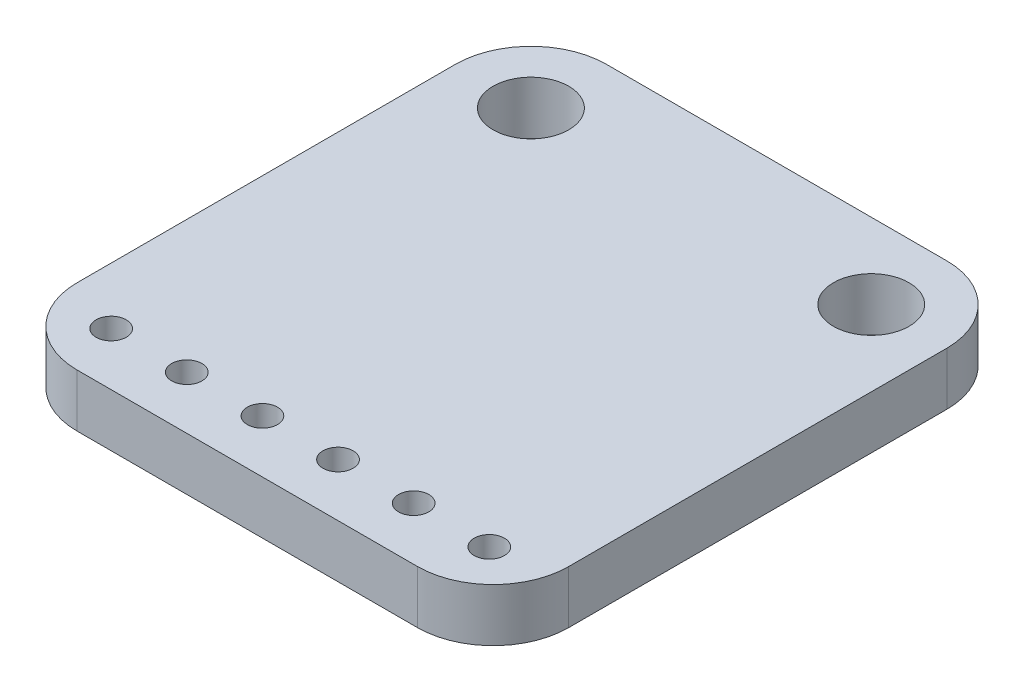
ISO-10303-21;
HEADER;
FILE_DESCRIPTION(('STEP AP214'),'2;1');
FILE_NAME('part.step','',(''),(''),'','','');
FILE_SCHEMA(('AUTOMOTIVE_DESIGN { 1 0 10303 214 1 1 1 1 }'));
ENDSEC;
DATA;
#1=APPLICATION_CONTEXT('core data for automotive mechanical design processes');
#2=APPLICATION_PROTOCOL_DEFINITION('international standard','automotive_design',2000,#1);
#3=PRODUCT_CONTEXT('',#1,'mechanical');
#4=PRODUCT('Part','Part','',(#3));
#5=PRODUCT_RELATED_PRODUCT_CATEGORY('part','',(#4));
#6=PRODUCT_DEFINITION_FORMATION('','',#4);
#7=PRODUCT_DEFINITION_CONTEXT('part definition',#1,'design');
#8=PRODUCT_DEFINITION('design','',#6,#7);
#9=PRODUCT_DEFINITION_SHAPE('','',#8);
#10=(LENGTH_UNIT() NAMED_UNIT(*) SI_UNIT(.MILLI.,.METRE.));
#11=(NAMED_UNIT(*) PLANE_ANGLE_UNIT() SI_UNIT($,.RADIAN.));
#12=(NAMED_UNIT(*) SI_UNIT($,.STERADIAN.) SOLID_ANGLE_UNIT());
#13=UNCERTAINTY_MEASURE_WITH_UNIT(LENGTH_MEASURE(1.E-05),#10,'distance_accuracy_value','');
#14=(GEOMETRIC_REPRESENTATION_CONTEXT(3) GLOBAL_UNCERTAINTY_ASSIGNED_CONTEXT((#13)) GLOBAL_UNIT_ASSIGNED_CONTEXT((#10,
#11,#12)) REPRESENTATION_CONTEXT('',''));
#15=CARTESIAN_POINT('',(0.,0.,0.));
#16=DIRECTION('',(0.,0.,1.));
#17=DIRECTION('',(1.,0.,0.));
#18=AXIS2_PLACEMENT_3D('',#15,#16,#17);
#19=CARTESIAN_POINT('',(0.,0.,0.));
#20=DIRECTION('',(0.,1.,0.));
#21=DIRECTION('',(0.,0.,1.));
#22=AXIS2_PLACEMENT_3D('',#19,#20,#21);
#23=PLANE('',#22);
#24=CARTESIAN_POINT('',(-5.715,0.,-6.34999999999999));
#25=DIRECTION('',(0.,-1.,0.));
#26=DIRECTION('',(0.,0.,-1.));
#27=AXIS2_PLACEMENT_3D('',#24,#25,#26);
#28=CIRCLE('',#27,1.27);
#29=CARTESIAN_POINT('',(-5.715,0.,-7.61999999999999));
#30=VERTEX_POINT('',#29);
#31=EDGE_CURVE('E518',#30,#30,#28,.T.);
#32=ORIENTED_EDGE('',*,*,#31,.F.);
#33=EDGE_LOOP('',(#32));
#34=FACE_BOUND('',#33,.T.);
#35=CARTESIAN_POINT('',(5.715,0.,-6.34999999999999));
#36=DIRECTION('',(0.,-1.,0.));
#37=DIRECTION('',(0.,0.,-1.));
#38=AXIS2_PLACEMENT_3D('',#35,#36,#37);
#39=CIRCLE('',#38,1.27);
#40=CARTESIAN_POINT('',(5.715,0.,-7.61999999999999));
#41=VERTEX_POINT('',#40);
#42=EDGE_CURVE('E495',#41,#41,#39,.T.);
#43=ORIENTED_EDGE('',*,*,#42,.F.);
#44=EDGE_LOOP('',(#43));
#45=FACE_BOUND('',#44,.T.);
#46=DIRECTION('',(0.,0.,1.));
#47=VECTOR('',#46,1.);
#48=CARTESIAN_POINT('',(-8.255,0.,-8.89));
#49=LINE('',#48,#47);
#50=CARTESIAN_POINT('',(-8.255,0.,-6.34999999999999));
#51=VERTEX_POINT('',#50);
#52=CARTESIAN_POINT('',(-8.255,0.,6.35));
#53=VERTEX_POINT('',#52);
#54=EDGE_CURVE('E258',#51,#53,#49,.T.);
#55=ORIENTED_EDGE('',*,*,#54,.F.);
#56=CARTESIAN_POINT('',(-5.715,0.,-6.34999999999999));
#57=DIRECTION('',(0.,1.,0.));
#58=DIRECTION('',(0.,0.,1.));
#59=AXIS2_PLACEMENT_3D('',#56,#57,#58);
#60=CIRCLE('',#59,2.54);
#61=CARTESIAN_POINT('',(-5.715,0.,-8.89));
#62=VERTEX_POINT('',#61);
#63=EDGE_CURVE('E280',#51,#62,#60,.F.);
#64=ORIENTED_EDGE('',*,*,#63,.T.);
#65=DIRECTION('',(-1.,0.,0.));
#66=VECTOR('',#65,1.);
#67=CARTESIAN_POINT('',(-8.255,0.,-8.89));
#68=LINE('',#67,#66);
#69=CARTESIAN_POINT('',(5.715,0.,-8.89));
#70=VERTEX_POINT('',#69);
#71=EDGE_CURVE('E254',#70,#62,#68,.T.);
#72=ORIENTED_EDGE('',*,*,#71,.F.);
#73=CARTESIAN_POINT('',(5.715,0.,-6.34999999999999));
#74=DIRECTION('',(0.,1.,0.));
#75=DIRECTION('',(0.,0.,1.));
#76=AXIS2_PLACEMENT_3D('',#73,#74,#75);
#77=CIRCLE('',#76,2.54);
#78=CARTESIAN_POINT('',(8.255,0.,-6.34999999999999));
#79=VERTEX_POINT('',#78);
#80=EDGE_CURVE('E277',#70,#79,#77,.F.);
#81=ORIENTED_EDGE('',*,*,#80,.T.);
#82=DIRECTION('',(0.,0.,-1.));
#83=VECTOR('',#82,1.);
#84=CARTESIAN_POINT('',(8.255,0.,-8.89));
#85=LINE('',#84,#83);
#86=CARTESIAN_POINT('',(8.255,0.,6.35));
#87=VERTEX_POINT('',#86);
#88=EDGE_CURVE('E232',#87,#79,#85,.T.);
#89=ORIENTED_EDGE('',*,*,#88,.F.);
#90=CARTESIAN_POINT('',(5.715,0.,6.35));
#91=DIRECTION('',(0.,1.,0.));
#92=DIRECTION('',(0.,0.,1.));
#93=AXIS2_PLACEMENT_3D('',#90,#91,#92);
#94=CIRCLE('',#93,2.54);
#95=CARTESIAN_POINT('',(5.715,0.,8.89));
#96=VERTEX_POINT('',#95);
#97=EDGE_CURVE('E274',#87,#96,#94,.F.);
#98=ORIENTED_EDGE('',*,*,#97,.T.);
#99=DIRECTION('',(1.,0.,0.));
#100=VECTOR('',#99,1.);
#101=CARTESIAN_POINT('',(-8.255,0.,8.89));
#102=LINE('',#101,#100);
#103=CARTESIAN_POINT('',(-5.715,0.,8.89));
#104=VERTEX_POINT('',#103);
#105=EDGE_CURVE('E238',#104,#96,#102,.T.);
#106=ORIENTED_EDGE('',*,*,#105,.F.);
#107=CARTESIAN_POINT('',(-5.715,0.,6.35));
#108=DIRECTION('',(0.,1.,0.));
#109=DIRECTION('',(0.,0.,1.));
#110=AXIS2_PLACEMENT_3D('',#107,#108,#109);
#111=CIRCLE('',#110,2.54);
#112=EDGE_CURVE('E271',#104,#53,#111,.F.);
#113=ORIENTED_EDGE('',*,*,#112,.T.);
#114=EDGE_LOOP('',(#55,#64,#72,#81,#89,#98,#106,#113));
#115=FACE_BOUND('',#114,.T.);
#116=CARTESIAN_POINT('',(-6.35,0.,7.112));
#117=DIRECTION('',(0.,1.,0.));
#118=DIRECTION('',(0.,0.,1.));
#119=AXIS2_PLACEMENT_3D('',#116,#117,#118);
#120=CIRCLE('',#119,0.508);
#121=CARTESIAN_POINT('',(-6.35,0.,7.62));
#122=VERTEX_POINT('',#121);
#123=EDGE_CURVE('E228',#122,#122,#120,.F.);
#124=ORIENTED_EDGE('',*,*,#123,.F.);
#125=EDGE_LOOP('',(#124));
#126=FACE_BOUND('',#125,.T.);
#127=CARTESIAN_POINT('',(-3.81,0.,7.112));
#128=DIRECTION('',(0.,1.,0.));
#129=DIRECTION('',(0.,0.,1.));
#130=AXIS2_PLACEMENT_3D('',#127,#128,#129);
#131=CIRCLE('',#130,0.508);
#132=CARTESIAN_POINT('',(-3.81,0.,7.62));
#133=VERTEX_POINT('',#132);
#134=EDGE_CURVE('E220',#133,#133,#131,.F.);
#135=ORIENTED_EDGE('',*,*,#134,.F.);
#136=EDGE_LOOP('',(#135));
#137=FACE_BOUND('',#136,.T.);
#138=CARTESIAN_POINT('',(-1.27,0.,7.112));
#139=DIRECTION('',(0.,1.,0.));
#140=DIRECTION('',(0.,0.,1.));
#141=AXIS2_PLACEMENT_3D('',#138,#139,#140);
#142=CIRCLE('',#141,0.508);
#143=CARTESIAN_POINT('',(-1.27,0.,7.62));
#144=VERTEX_POINT('',#143);
#145=EDGE_CURVE('E212',#144,#144,#142,.F.);
#146=ORIENTED_EDGE('',*,*,#145,.F.);
#147=EDGE_LOOP('',(#146));
#148=FACE_BOUND('',#147,.T.);
#149=CARTESIAN_POINT('',(1.27,0.,7.112));
#150=DIRECTION('',(0.,1.,0.));
#151=DIRECTION('',(0.,0.,1.));
#152=AXIS2_PLACEMENT_3D('',#149,#150,#151);
#153=CIRCLE('',#152,0.508);
#154=CARTESIAN_POINT('',(1.27,0.,7.62));
#155=VERTEX_POINT('',#154);
#156=EDGE_CURVE('E204',#155,#155,#153,.F.);
#157=ORIENTED_EDGE('',*,*,#156,.F.);
#158=EDGE_LOOP('',(#157));
#159=FACE_BOUND('',#158,.T.);
#160=CARTESIAN_POINT('',(3.81,0.,7.112));
#161=DIRECTION('',(0.,1.,0.));
#162=DIRECTION('',(0.,0.,1.));
#163=AXIS2_PLACEMENT_3D('',#160,#161,#162);
#164=CIRCLE('',#163,0.508000000000001);
#165=CARTESIAN_POINT('',(3.81,0.,7.62));
#166=VERTEX_POINT('',#165);
#167=EDGE_CURVE('E196',#166,#166,#164,.F.);
#168=ORIENTED_EDGE('',*,*,#167,.F.);
#169=EDGE_LOOP('',(#168));
#170=FACE_BOUND('',#169,.T.);
#171=CARTESIAN_POINT('',(6.35,0.,7.112));
#172=DIRECTION('',(0.,1.,0.));
#173=DIRECTION('',(0.,0.,1.));
#174=AXIS2_PLACEMENT_3D('',#171,#172,#173);
#175=CIRCLE('',#174,0.508000000000001);
#176=CARTESIAN_POINT('',(6.35,0.,7.62));
#177=VERTEX_POINT('',#176);
#178=EDGE_CURVE('E182',#177,#177,#175,.F.);
#179=ORIENTED_EDGE('',*,*,#178,.F.);
#180=EDGE_LOOP('',(#179));
#181=FACE_BOUND('',#180,.T.);
#182=DIRECTION('',(0.,0.,1.));
#183=VECTOR('',#182,1.);
#184=CARTESIAN_POINT('',(1.975,0.,-3.24499999999999));
#185=LINE('',#184,#183);
#186=CARTESIAN_POINT('',(1.975,0.,-3.24499999999999));
#187=VERTEX_POINT('',#186);
#188=CARTESIAN_POINT('',(1.975,0.,0.705000000000006));
#189=VERTEX_POINT('',#188);
#190=EDGE_CURVE('E176',#187,#189,#185,.T.);
#191=ORIENTED_EDGE('',*,*,#190,.F.);
#192=DIRECTION('',(1.,0.,0.));
#193=VECTOR('',#192,1.);
#194=CARTESIAN_POINT('',(1.975,0.,-3.24499999999999));
#195=LINE('',#194,#193);
#196=CARTESIAN_POINT('',(-1.975,0.,-3.24499999999999));
#197=VERTEX_POINT('',#196);
#198=EDGE_CURVE('E173',#197,#187,#195,.T.);
#199=ORIENTED_EDGE('',*,*,#198,.F.);
#200=DIRECTION('',(0.,0.,-1.));
#201=VECTOR('',#200,1.);
#202=CARTESIAN_POINT('',(-1.975,0.,-3.24499999999999));
#203=LINE('',#202,#201);
#204=CARTESIAN_POINT('',(-1.975,0.,0.705000000000005));
#205=VERTEX_POINT('',#204);
#206=EDGE_CURVE('E68',#205,#197,#203,.T.);
#207=ORIENTED_EDGE('',*,*,#206,.F.);
#208=DIRECTION('',(-1.,0.,0.));
#209=VECTOR('',#208,1.);
#210=CARTESIAN_POINT('',(1.975,0.,0.705000000000006));
#211=LINE('',#210,#209);
#212=EDGE_CURVE('E60',#189,#205,#211,.T.);
#213=ORIENTED_EDGE('',*,*,#212,.F.);
#214=EDGE_LOOP('',(#191,#199,#207,#213));
#215=FACE_BOUND('',#214,.T.);
#216=ADVANCED_FACE('F41',(#34,#45,#115,#126,#137,#148,#159,#170,#181,#215),#23,.F.);
#217=CARTESIAN_POINT('',(8.255,1.778,-8.89));
#218=DIRECTION('',(-1.,0.,0.));
#219=DIRECTION('',(0.,0.,1.));
#220=AXIS2_PLACEMENT_3D('',#217,#218,#219);
#221=PLANE('',#220);
#222=ORIENTED_EDGE('',*,*,#88,.T.);
#223=DIRECTION('',(0.,-1.,0.));
#224=VECTOR('',#223,1.);
#225=CARTESIAN_POINT('',(8.255,1.778,-6.34999999999999));
#226=LINE('',#225,#224);
#227=CARTESIAN_POINT('',(8.255,1.778,-6.34999999999999));
#228=VERTEX_POINT('',#227);
#229=EDGE_CURVE('E306',#79,#228,#226,.F.);
#230=ORIENTED_EDGE('',*,*,#229,.T.);
#231=DIRECTION('',(0.,0.,-1.));
#232=VECTOR('',#231,1.);
#233=CARTESIAN_POINT('',(8.255,1.778,-8.89));
#234=LINE('',#233,#232);
#235=CARTESIAN_POINT('',(8.255,1.778,6.35));
#236=VERTEX_POINT('',#235);
#237=EDGE_CURVE('E233',#236,#228,#234,.T.);
#238=ORIENTED_EDGE('',*,*,#237,.F.);
#239=DIRECTION('',(0.,-1.,0.));
#240=VECTOR('',#239,1.);
#241=CARTESIAN_POINT('',(8.255,1.778,6.35));
#242=LINE('',#241,#240);
#243=EDGE_CURVE('E302',#236,#87,#242,.T.);
#244=ORIENTED_EDGE('',*,*,#243,.T.);
#245=EDGE_LOOP('',(#222,#230,#238,#244));
#246=FACE_BOUND('',#245,.T.);
#247=ADVANCED_FACE('F328',(#246),#221,.F.);
#248=CARTESIAN_POINT('',(-8.255,1.778,-8.89));
#249=DIRECTION('',(0.,0.,1.));
#250=DIRECTION('',(1.,0.,0.));
#251=AXIS2_PLACEMENT_3D('',#248,#249,#250);
#252=PLANE('',#251);
#253=ORIENTED_EDGE('',*,*,#71,.T.);
#254=DIRECTION('',(0.,-1.,0.));
#255=VECTOR('',#254,1.);
#256=CARTESIAN_POINT('',(-5.715,1.778,-8.89));
#257=LINE('',#256,#255);
#258=CARTESIAN_POINT('',(-5.715,1.778,-8.89));
#259=VERTEX_POINT('',#258);
#260=EDGE_CURVE('E287',#62,#259,#257,.F.);
#261=ORIENTED_EDGE('',*,*,#260,.T.);
#262=DIRECTION('',(-1.,0.,0.));
#263=VECTOR('',#262,1.);
#264=CARTESIAN_POINT('',(-8.255,1.778,-8.89));
#265=LINE('',#264,#263);
#266=CARTESIAN_POINT('',(5.715,1.778,-8.89));
#267=VERTEX_POINT('',#266);
#268=EDGE_CURVE('E237',#267,#259,#265,.T.);
#269=ORIENTED_EDGE('',*,*,#268,.F.);
#270=DIRECTION('',(0.,-1.,0.));
#271=VECTOR('',#270,1.);
#272=CARTESIAN_POINT('',(5.715,1.778,-8.89));
#273=LINE('',#272,#271);
#274=EDGE_CURVE('E283',#267,#70,#273,.T.);
#275=ORIENTED_EDGE('',*,*,#274,.T.);
#276=EDGE_LOOP('',(#253,#261,#269,#275));
#277=FACE_BOUND('',#276,.T.);
#278=ADVANCED_FACE('F339',(#277),#252,.F.);
#279=CARTESIAN_POINT('',(-8.255,1.778,-8.89));
#280=DIRECTION('',(1.,0.,0.));
#281=DIRECTION('',(0.,0.,-1.));
#282=AXIS2_PLACEMENT_3D('',#279,#280,#281);
#283=PLANE('',#282);
#284=DIRECTION('',(0.,0.,1.));
#285=VECTOR('',#284,1.);
#286=CARTESIAN_POINT('',(-8.255,1.778,-8.89));
#287=LINE('',#286,#285);
#288=CARTESIAN_POINT('',(-8.255,1.778,-6.34999999999999));
#289=VERTEX_POINT('',#288);
#290=CARTESIAN_POINT('',(-8.255,1.778,6.35));
#291=VERTEX_POINT('',#290);
#292=EDGE_CURVE('E242',#289,#291,#287,.T.);
#293=ORIENTED_EDGE('',*,*,#292,.F.);
#294=DIRECTION('',(0.,-1.,0.));
#295=VECTOR('',#294,1.);
#296=CARTESIAN_POINT('',(-8.255,1.778,-6.34999999999999));
#297=LINE('',#296,#295);
#298=EDGE_CURVE('E267',#289,#51,#297,.T.);
#299=ORIENTED_EDGE('',*,*,#298,.T.);
#300=ORIENTED_EDGE('',*,*,#54,.T.);
#301=DIRECTION('',(0.,-1.,0.));
#302=VECTOR('',#301,1.);
#303=CARTESIAN_POINT('',(-8.255,1.778,6.35));
#304=LINE('',#303,#302);
#305=EDGE_CURVE('E250',#53,#291,#304,.F.);
#306=ORIENTED_EDGE('',*,*,#305,.T.);
#307=EDGE_LOOP('',(#293,#299,#300,#306));
#308=FACE_BOUND('',#307,.T.);
#309=ADVANCED_FACE('F347',(#308),#283,.F.);
#310=CARTESIAN_POINT('',(-8.255,1.778,8.89));
#311=DIRECTION('',(0.,0.,-1.));
#312=DIRECTION('',(-1.,0.,0.));
#313=AXIS2_PLACEMENT_3D('',#310,#311,#312);
#314=PLANE('',#313);
#315=ORIENTED_EDGE('',*,*,#105,.T.);
#316=DIRECTION('',(0.,-1.,0.));
#317=VECTOR('',#316,1.);
#318=CARTESIAN_POINT('',(5.715,1.778,8.89));
#319=LINE('',#318,#317);
#320=CARTESIAN_POINT('',(5.715,1.778,8.89));
#321=VERTEX_POINT('',#320);
#322=EDGE_CURVE('E11',#96,#321,#319,.F.);
#323=ORIENTED_EDGE('',*,*,#322,.T.);
#324=DIRECTION('',(1.,0.,0.));
#325=VECTOR('',#324,1.);
#326=CARTESIAN_POINT('',(-8.255,1.778,8.89));
#327=LINE('',#326,#325);
#328=CARTESIAN_POINT('',(-5.715,1.778,8.89));
#329=VERTEX_POINT('',#328);
#330=EDGE_CURVE('E246',#329,#321,#327,.T.);
#331=ORIENTED_EDGE('',*,*,#330,.F.);
#332=DIRECTION('',(0.,-1.,0.));
#333=VECTOR('',#332,1.);
#334=CARTESIAN_POINT('',(-5.715,1.778,8.89));
#335=LINE('',#334,#333);
#336=EDGE_CURVE('E50',#329,#104,#335,.T.);
#337=ORIENTED_EDGE('',*,*,#336,.T.);
#338=EDGE_LOOP('',(#315,#323,#331,#337));
#339=FACE_BOUND('',#338,.T.);
#340=ADVANCED_FACE('F314',(#339),#314,.F.);
#341=CARTESIAN_POINT('',(0.,1.778,0.));
#342=DIRECTION('',(0.,1.,0.));
#343=DIRECTION('',(0.,0.,1.));
#344=AXIS2_PLACEMENT_3D('',#341,#342,#343);
#345=PLANE('',#344);
#346=CARTESIAN_POINT('',(-5.715,1.778,-6.34999999999999));
#347=DIRECTION('',(0.,1.,0.));
#348=DIRECTION('',(0.,0.,1.));
#349=AXIS2_PLACEMENT_3D('',#346,#347,#348);
#350=CIRCLE('',#349,1.27);
#351=CARTESIAN_POINT('',(-5.715,1.778,-5.07999999999999));
#352=VERTEX_POINT('',#351);
#353=EDGE_CURVE('E522',#352,#352,#350,.F.);
#354=ORIENTED_EDGE('',*,*,#353,.T.);
#355=EDGE_LOOP('',(#354));
#356=FACE_BOUND('',#355,.T.);
#357=CARTESIAN_POINT('',(5.715,1.778,-6.34999999999999));
#358=DIRECTION('',(0.,1.,0.));
#359=DIRECTION('',(0.,0.,1.));
#360=AXIS2_PLACEMENT_3D('',#357,#358,#359);
#361=CIRCLE('',#360,1.27);
#362=CARTESIAN_POINT('',(5.715,1.778,-5.07999999999999));
#363=VERTEX_POINT('',#362);
#364=EDGE_CURVE('E514',#363,#363,#361,.F.);
#365=ORIENTED_EDGE('',*,*,#364,.T.);
#366=EDGE_LOOP('',(#365));
#367=FACE_BOUND('',#366,.T.);
#368=CARTESIAN_POINT('',(6.35,1.778,7.112));
#369=DIRECTION('',(0.,1.,0.));
#370=DIRECTION('',(0.,0.,1.));
#371=AXIS2_PLACEMENT_3D('',#368,#369,#370);
#372=CIRCLE('',#371,0.508000000000001);
#373=CARTESIAN_POINT('',(6.35,1.778,7.62));
#374=VERTEX_POINT('',#373);
#375=EDGE_CURVE('E178',#374,#374,#372,.T.);
#376=ORIENTED_EDGE('',*,*,#375,.F.);
#377=EDGE_LOOP('',(#376));
#378=FACE_BOUND('',#377,.T.);
#379=CARTESIAN_POINT('',(3.81,1.778,7.112));
#380=DIRECTION('',(0.,1.,0.));
#381=DIRECTION('',(0.,0.,1.));
#382=AXIS2_PLACEMENT_3D('',#379,#380,#381);
#383=CIRCLE('',#382,0.508000000000001);
#384=CARTESIAN_POINT('',(3.81,1.778,7.62));
#385=VERTEX_POINT('',#384);
#386=EDGE_CURVE('E192',#385,#385,#383,.T.);
#387=ORIENTED_EDGE('',*,*,#386,.F.);
#388=EDGE_LOOP('',(#387));
#389=FACE_BOUND('',#388,.T.);
#390=CARTESIAN_POINT('',(1.27,1.778,7.112));
#391=DIRECTION('',(0.,1.,0.));
#392=DIRECTION('',(0.,0.,1.));
#393=AXIS2_PLACEMENT_3D('',#390,#391,#392);
#394=CIRCLE('',#393,0.508);
#395=CARTESIAN_POINT('',(1.27,1.778,7.62));
#396=VERTEX_POINT('',#395);
#397=EDGE_CURVE('E200',#396,#396,#394,.T.);
#398=ORIENTED_EDGE('',*,*,#397,.F.);
#399=EDGE_LOOP('',(#398));
#400=FACE_BOUND('',#399,.T.);
#401=CARTESIAN_POINT('',(-1.27,1.778,7.112));
#402=DIRECTION('',(0.,1.,0.));
#403=DIRECTION('',(0.,0.,1.));
#404=AXIS2_PLACEMENT_3D('',#401,#402,#403);
#405=CIRCLE('',#404,0.508);
#406=CARTESIAN_POINT('',(-1.27,1.778,7.62));
#407=VERTEX_POINT('',#406);
#408=EDGE_CURVE('E208',#407,#407,#405,.T.);
#409=ORIENTED_EDGE('',*,*,#408,.F.);
#410=EDGE_LOOP('',(#409));
#411=FACE_BOUND('',#410,.T.);
#412=CARTESIAN_POINT('',(-3.81,1.778,7.112));
#413=DIRECTION('',(0.,1.,0.));
#414=DIRECTION('',(0.,0.,1.));
#415=AXIS2_PLACEMENT_3D('',#412,#413,#414);
#416=CIRCLE('',#415,0.508);
#417=CARTESIAN_POINT('',(-3.81,1.778,7.62));
#418=VERTEX_POINT('',#417);
#419=EDGE_CURVE('E216',#418,#418,#416,.T.);
#420=ORIENTED_EDGE('',*,*,#419,.F.);
#421=EDGE_LOOP('',(#420));
#422=FACE_BOUND('',#421,.T.);
#423=CARTESIAN_POINT('',(-6.35,1.778,7.112));
#424=DIRECTION('',(0.,1.,0.));
#425=DIRECTION('',(0.,0.,1.));
#426=AXIS2_PLACEMENT_3D('',#423,#424,#425);
#427=CIRCLE('',#426,0.508);
#428=CARTESIAN_POINT('',(-6.35,1.778,7.62));
#429=VERTEX_POINT('',#428);
#430=EDGE_CURVE('E224',#429,#429,#427,.T.);
#431=ORIENTED_EDGE('',*,*,#430,.F.);
#432=EDGE_LOOP('',(#431));
#433=FACE_BOUND('',#432,.T.);
#434=ORIENTED_EDGE('',*,*,#268,.T.);
#435=CARTESIAN_POINT('',(-5.715,1.778,-6.34999999999999));
#436=DIRECTION('',(0.,1.,0.));
#437=DIRECTION('',(0.,0.,1.));
#438=AXIS2_PLACEMENT_3D('',#435,#436,#437);
#439=CIRCLE('',#438,2.54);
#440=EDGE_CURVE('E299',#259,#289,#439,.T.);
#441=ORIENTED_EDGE('',*,*,#440,.T.);
#442=ORIENTED_EDGE('',*,*,#292,.T.);
#443=CARTESIAN_POINT('',(-5.715,1.778,6.35));
#444=DIRECTION('',(0.,1.,0.));
#445=DIRECTION('',(0.,0.,1.));
#446=AXIS2_PLACEMENT_3D('',#443,#444,#445);
#447=CIRCLE('',#446,2.54);
#448=EDGE_CURVE('E290',#291,#329,#447,.T.);
#449=ORIENTED_EDGE('',*,*,#448,.T.);
#450=ORIENTED_EDGE('',*,*,#330,.T.);
#451=CARTESIAN_POINT('',(5.715,1.778,6.35));
#452=DIRECTION('',(0.,1.,0.));
#453=DIRECTION('',(0.,0.,1.));
#454=AXIS2_PLACEMENT_3D('',#451,#452,#453);
#455=CIRCLE('',#454,2.54);
#456=EDGE_CURVE('E293',#321,#236,#455,.T.);
#457=ORIENTED_EDGE('',*,*,#456,.T.);
#458=ORIENTED_EDGE('',*,*,#237,.T.);
#459=CARTESIAN_POINT('',(5.715,1.778,-6.34999999999999));
#460=DIRECTION('',(0.,1.,0.));
#461=DIRECTION('',(0.,0.,1.));
#462=AXIS2_PLACEMENT_3D('',#459,#460,#461);
#463=CIRCLE('',#462,2.54);
#464=EDGE_CURVE('E296',#228,#267,#463,.T.);
#465=ORIENTED_EDGE('',*,*,#464,.T.);
#466=EDGE_LOOP('',(#434,#441,#442,#449,#450,#457,#458,#465));
#467=FACE_BOUND('',#466,.T.);
#468=ADVANCED_FACE('F332',(#356,#367,#378,#389,#400,#411,#422,#433,#467),#345,.T.);
#469=CARTESIAN_POINT('',(-5.715,1.778,-6.34999999999999));
#470=DIRECTION('',(0.,-1.,0.));
#471=DIRECTION('',(0.,0.,-1.));
#472=AXIS2_PLACEMENT_3D('',#469,#470,#471);
#473=CYLINDRICAL_SURFACE('',#472,2.54);
#474=ORIENTED_EDGE('',*,*,#440,.F.);
#475=ORIENTED_EDGE('',*,*,#260,.F.);
#476=ORIENTED_EDGE('',*,*,#63,.F.);
#477=ORIENTED_EDGE('',*,*,#298,.F.);
#478=EDGE_LOOP('',(#474,#475,#476,#477));
#479=FACE_BOUND('',#478,.T.);
#480=ADVANCED_FACE('F344',(#479),#473,.T.);
#481=CARTESIAN_POINT('',(5.715,1.778,-6.34999999999999));
#482=DIRECTION('',(0.,-1.,0.));
#483=DIRECTION('',(0.,0.,-1.));
#484=AXIS2_PLACEMENT_3D('',#481,#482,#483);
#485=CYLINDRICAL_SURFACE('',#484,2.54);
#486=ORIENTED_EDGE('',*,*,#464,.F.);
#487=ORIENTED_EDGE('',*,*,#229,.F.);
#488=ORIENTED_EDGE('',*,*,#80,.F.);
#489=ORIENTED_EDGE('',*,*,#274,.F.);
#490=EDGE_LOOP('',(#486,#487,#488,#489));
#491=FACE_BOUND('',#490,.T.);
#492=ADVANCED_FACE('F336',(#491),#485,.T.);
#493=CARTESIAN_POINT('',(5.715,1.778,6.35));
#494=DIRECTION('',(0.,-1.,0.));
#495=DIRECTION('',(0.,0.,-1.));
#496=AXIS2_PLACEMENT_3D('',#493,#494,#495);
#497=CYLINDRICAL_SURFACE('',#496,2.54);
#498=ORIENTED_EDGE('',*,*,#456,.F.);
#499=ORIENTED_EDGE('',*,*,#322,.F.);
#500=ORIENTED_EDGE('',*,*,#97,.F.);
#501=ORIENTED_EDGE('',*,*,#243,.F.);
#502=EDGE_LOOP('',(#498,#499,#500,#501));
#503=FACE_BOUND('',#502,.T.);
#504=ADVANCED_FACE('F325',(#503),#497,.T.);
#505=CARTESIAN_POINT('',(-5.715,1.778,6.35));
#506=DIRECTION('',(0.,-1.,0.));
#507=DIRECTION('',(0.,0.,-1.));
#508=AXIS2_PLACEMENT_3D('',#505,#506,#507);
#509=CYLINDRICAL_SURFACE('',#508,2.54);
#510=ORIENTED_EDGE('',*,*,#448,.F.);
#511=ORIENTED_EDGE('',*,*,#305,.F.);
#512=ORIENTED_EDGE('',*,*,#112,.F.);
#513=ORIENTED_EDGE('',*,*,#336,.F.);
#514=EDGE_LOOP('',(#510,#511,#512,#513));
#515=FACE_BOUND('',#514,.T.);
#516=ADVANCED_FACE('F43',(#515),#509,.T.);
#517=CARTESIAN_POINT('',(-6.35,-0.000999999999999916,7.112));
#518=DIRECTION('',(0.,1.,0.));
#519=DIRECTION('',(0.,0.,1.));
#520=AXIS2_PLACEMENT_3D('',#517,#518,#519);
#521=CYLINDRICAL_SURFACE('',#520,0.508);
#522=ORIENTED_EDGE('',*,*,#430,.T.);
#523=EDGE_LOOP('',(#522));
#524=FACE_BOUND('',#523,.T.);
#525=ORIENTED_EDGE('',*,*,#123,.T.);
#526=EDGE_LOOP('',(#525));
#527=FACE_BOUND('',#526,.T.);
#528=ADVANCED_FACE('F350',(#524,#527),#521,.F.);
#529=CARTESIAN_POINT('',(-3.81,-0.000999999999999916,7.112));
#530=DIRECTION('',(0.,1.,0.));
#531=DIRECTION('',(0.,0.,1.));
#532=AXIS2_PLACEMENT_3D('',#529,#530,#531);
#533=CYLINDRICAL_SURFACE('',#532,0.508);
#534=ORIENTED_EDGE('',*,*,#419,.T.);
#535=EDGE_LOOP('',(#534));
#536=FACE_BOUND('',#535,.T.);
#537=ORIENTED_EDGE('',*,*,#134,.T.);
#538=EDGE_LOOP('',(#537));
#539=FACE_BOUND('',#538,.T.);
#540=ADVANCED_FACE('F355',(#536,#539),#533,.F.);
#541=CARTESIAN_POINT('',(-1.27,-0.000999999999999916,7.112));
#542=DIRECTION('',(0.,1.,0.));
#543=DIRECTION('',(0.,0.,1.));
#544=AXIS2_PLACEMENT_3D('',#541,#542,#543);
#545=CYLINDRICAL_SURFACE('',#544,0.508);
#546=ORIENTED_EDGE('',*,*,#408,.T.);
#547=EDGE_LOOP('',(#546));
#548=FACE_BOUND('',#547,.T.);
#549=ORIENTED_EDGE('',*,*,#145,.T.);
#550=EDGE_LOOP('',(#549));
#551=FACE_BOUND('',#550,.T.);
#552=ADVANCED_FACE('F417',(#548,#551),#545,.F.);
#553=CARTESIAN_POINT('',(1.27,-0.000999999999999916,7.112));
#554=DIRECTION('',(0.,1.,0.));
#555=DIRECTION('',(0.,0.,1.));
#556=AXIS2_PLACEMENT_3D('',#553,#554,#555);
#557=CYLINDRICAL_SURFACE('',#556,0.508);
#558=ORIENTED_EDGE('',*,*,#397,.T.);
#559=EDGE_LOOP('',(#558));
#560=FACE_BOUND('',#559,.T.);
#561=ORIENTED_EDGE('',*,*,#156,.T.);
#562=EDGE_LOOP('',(#561));
#563=FACE_BOUND('',#562,.T.);
#564=ADVANCED_FACE('F401',(#560,#563),#557,.F.);
#565=CARTESIAN_POINT('',(3.81,-0.000999999999999916,7.112));
#566=DIRECTION('',(0.,1.,0.));
#567=DIRECTION('',(0.,0.,1.));
#568=AXIS2_PLACEMENT_3D('',#565,#566,#567);
#569=CYLINDRICAL_SURFACE('',#568,0.508000000000001);
#570=ORIENTED_EDGE('',*,*,#386,.T.);
#571=EDGE_LOOP('',(#570));
#572=FACE_BOUND('',#571,.T.);
#573=ORIENTED_EDGE('',*,*,#167,.T.);
#574=EDGE_LOOP('',(#573));
#575=FACE_BOUND('',#574,.T.);
#576=ADVANCED_FACE('F397',(#572,#575),#569,.F.);
#577=CARTESIAN_POINT('',(6.35,-0.000999999999999916,7.112));
#578=DIRECTION('',(0.,1.,0.));
#579=DIRECTION('',(0.,0.,1.));
#580=AXIS2_PLACEMENT_3D('',#577,#578,#579);
#581=CYLINDRICAL_SURFACE('',#580,0.508000000000001);
#582=ORIENTED_EDGE('',*,*,#375,.T.);
#583=EDGE_LOOP('',(#582));
#584=FACE_BOUND('',#583,.T.);
#585=ORIENTED_EDGE('',*,*,#178,.T.);
#586=EDGE_LOOP('',(#585));
#587=FACE_BOUND('',#586,.T.);
#588=ADVANCED_FACE('F393',(#584,#587),#581,.F.);
#589=CARTESIAN_POINT('',(1.975,-1.397,-3.24499999999999));
#590=DIRECTION('',(-1.,0.,0.));
#591=DIRECTION('',(0.,0.,1.));
#592=AXIS2_PLACEMENT_3D('',#589,#590,#591);
#593=PLANE('',#592);
#594=ORIENTED_EDGE('',*,*,#190,.T.);
#595=DIRECTION('',(0.,1.,0.));
#596=VECTOR('',#595,1.);
#597=CARTESIAN_POINT('',(1.975,-1.397,0.705000000000006));
#598=LINE('',#597,#596);
#599=CARTESIAN_POINT('',(1.975,-1.397,0.705000000000006));
#600=VERTEX_POINT('',#599);
#601=EDGE_CURVE('E155',#600,#189,#598,.T.);
#602=ORIENTED_EDGE('',*,*,#601,.F.);
#603=DIRECTION('',(0.,0.,1.));
#604=VECTOR('',#603,1.);
#605=CARTESIAN_POINT('',(1.975,-1.397,-3.24499999999999));
#606=LINE('',#605,#604);
#607=CARTESIAN_POINT('',(1.975,-1.397,-3.24499999999999));
#608=VERTEX_POINT('',#607);
#609=EDGE_CURVE('E163',#608,#600,#606,.T.);
#610=ORIENTED_EDGE('',*,*,#609,.F.);
#611=DIRECTION('',(0.,1.,0.));
#612=VECTOR('',#611,1.);
#613=CARTESIAN_POINT('',(1.975,-1.397,-3.24499999999999));
#614=LINE('',#613,#612);
#615=EDGE_CURVE('E498',#608,#187,#614,.T.);
#616=ORIENTED_EDGE('',*,*,#615,.T.);
#617=EDGE_LOOP('',(#594,#602,#610,#616));
#618=FACE_BOUND('',#617,.T.);
#619=ADVANCED_FACE('F175',(#618),#593,.F.);
#620=CARTESIAN_POINT('',(1.975,-1.397,0.705000000000006));
#621=DIRECTION('',(0.,0.,-1.));
#622=DIRECTION('',(-1.,0.,0.));
#623=AXIS2_PLACEMENT_3D('',#620,#621,#622);
#624=PLANE('',#623);
#625=ORIENTED_EDGE('',*,*,#212,.T.);
#626=DIRECTION('',(0.,1.,0.));
#627=VECTOR('',#626,1.);
#628=CARTESIAN_POINT('',(-1.975,-1.397,0.705000000000005));
#629=LINE('',#628,#627);
#630=CARTESIAN_POINT('',(-1.975,-1.397,0.705000000000005));
#631=VERTEX_POINT('',#630);
#632=EDGE_CURVE('E158',#631,#205,#629,.T.);
#633=ORIENTED_EDGE('',*,*,#632,.F.);
#634=DIRECTION('',(-1.,0.,0.));
#635=VECTOR('',#634,1.);
#636=CARTESIAN_POINT('',(1.975,-1.397,0.705000000000006));
#637=LINE('',#636,#635);
#638=EDGE_CURVE('E151',#600,#631,#637,.T.);
#639=ORIENTED_EDGE('',*,*,#638,.F.);
#640=ORIENTED_EDGE('',*,*,#601,.T.);
#641=EDGE_LOOP('',(#625,#633,#639,#640));
#642=FACE_BOUND('',#641,.T.);
#643=ADVANCED_FACE('F153',(#642),#624,.F.);
#644=CARTESIAN_POINT('',(-1.975,-1.397,-3.24499999999999));
#645=DIRECTION('',(1.,0.,0.));
#646=DIRECTION('',(0.,0.,-1.));
#647=AXIS2_PLACEMENT_3D('',#644,#645,#646);
#648=PLANE('',#647);
#649=ORIENTED_EDGE('',*,*,#206,.T.);
#650=DIRECTION('',(0.,1.,0.));
#651=VECTOR('',#650,1.);
#652=CARTESIAN_POINT('',(-1.975,-1.397,-3.24499999999999));
#653=LINE('',#652,#651);
#654=CARTESIAN_POINT('',(-1.975,-1.397,-3.24499999999999));
#655=VERTEX_POINT('',#654);
#656=EDGE_CURVE('E185',#655,#197,#653,.T.);
#657=ORIENTED_EDGE('',*,*,#656,.F.);
#658=DIRECTION('',(0.,0.,-1.));
#659=VECTOR('',#658,1.);
#660=CARTESIAN_POINT('',(-1.975,-1.397,-3.24499999999999));
#661=LINE('',#660,#659);
#662=EDGE_CURVE('E162',#631,#655,#661,.T.);
#663=ORIENTED_EDGE('',*,*,#662,.F.);
#664=ORIENTED_EDGE('',*,*,#632,.T.);
#665=EDGE_LOOP('',(#649,#657,#663,#664));
#666=FACE_BOUND('',#665,.T.);
#667=ADVANCED_FACE('F466',(#666),#648,.F.);
#668=CARTESIAN_POINT('',(1.975,-1.397,-3.24499999999999));
#669=DIRECTION('',(0.,0.,1.));
#670=DIRECTION('',(1.,0.,0.));
#671=AXIS2_PLACEMENT_3D('',#668,#669,#670);
#672=PLANE('',#671);
#673=ORIENTED_EDGE('',*,*,#198,.T.);
#674=ORIENTED_EDGE('',*,*,#615,.F.);
#675=DIRECTION('',(1.,0.,0.));
#676=VECTOR('',#675,1.);
#677=CARTESIAN_POINT('',(1.975,-1.397,-3.24499999999999));
#678=LINE('',#677,#676);
#679=EDGE_CURVE('E168',#655,#608,#678,.T.);
#680=ORIENTED_EDGE('',*,*,#679,.F.);
#681=ORIENTED_EDGE('',*,*,#656,.T.);
#682=EDGE_LOOP('',(#673,#674,#680,#681));
#683=FACE_BOUND('',#682,.T.);
#684=ADVANCED_FACE('F460',(#683),#672,.F.);
#685=CARTESIAN_POINT('',(0.,-1.397,0.));
#686=DIRECTION('',(0.,-1.,0.));
#687=DIRECTION('',(0.,0.,-1.));
#688=AXIS2_PLACEMENT_3D('',#685,#686,#687);
#689=PLANE('',#688);
#690=ORIENTED_EDGE('',*,*,#609,.T.);
#691=ORIENTED_EDGE('',*,*,#638,.T.);
#692=ORIENTED_EDGE('',*,*,#662,.T.);
#693=ORIENTED_EDGE('',*,*,#679,.T.);
#694=EDGE_LOOP('',(#690,#691,#692,#693));
#695=FACE_BOUND('',#694,.T.);
#696=ADVANCED_FACE('F166',(#695),#689,.T.);
#697=CARTESIAN_POINT('',(5.715,1.779,-6.34999999999999));
#698=DIRECTION('',(0.,-1.,0.));
#699=DIRECTION('',(0.,0.,-1.));
#700=AXIS2_PLACEMENT_3D('',#697,#698,#699);
#701=CYLINDRICAL_SURFACE('',#700,1.27);
#702=ORIENTED_EDGE('',*,*,#364,.F.);
#703=EDGE_LOOP('',(#702));
#704=FACE_BOUND('',#703,.T.);
#705=ORIENTED_EDGE('',*,*,#42,.T.);
#706=EDGE_LOOP('',(#705));
#707=FACE_BOUND('',#706,.T.);
#708=ADVANCED_FACE('F442',(#704,#707),#701,.F.);
#709=CARTESIAN_POINT('',(-5.715,1.779,-6.34999999999999));
#710=DIRECTION('',(0.,-1.,0.));
#711=DIRECTION('',(0.,0.,-1.));
#712=AXIS2_PLACEMENT_3D('',#709,#710,#711);
#713=CYLINDRICAL_SURFACE('',#712,1.27);
#714=ORIENTED_EDGE('',*,*,#353,.F.);
#715=EDGE_LOOP('',(#714));
#716=FACE_BOUND('',#715,.T.);
#717=ORIENTED_EDGE('',*,*,#31,.T.);
#718=EDGE_LOOP('',(#717));
#719=FACE_BOUND('',#718,.T.);
#720=ADVANCED_FACE('F439',(#716,#719),#713,.F.);
#721=CLOSED_SHELL('',(#216,#247,#278,#309,#340,#468,#480,#492,#504,#516,#528,#540,#552,#564,
#576,#588,#619,#643,#667,#684,#696,#708,#720));
#722=MANIFOLD_SOLID_BREP('B2',#721);
#723=ADVANCED_BREP_SHAPE_REPRESENTATION('',(#18,#722),#14);
#724=SHAPE_DEFINITION_REPRESENTATION(#9,#723);
ENDSEC;
END-ISO-10303-21;
